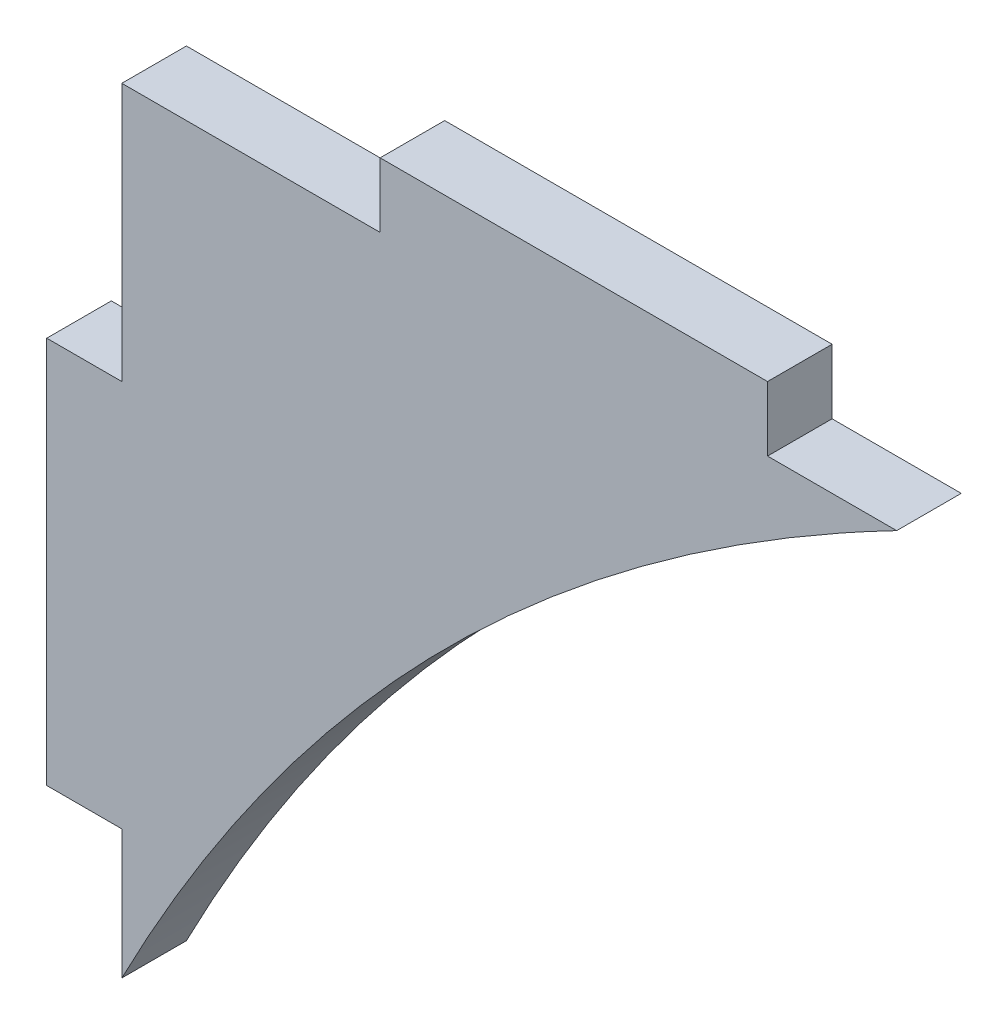
ISO-10303-21;
HEADER;
FILE_DESCRIPTION(('STEP AP214'),'2;1');
FILE_NAME('part.step','',(''),(''),'','','');
FILE_SCHEMA(('AUTOMOTIVE_DESIGN { 1 0 10303 214 1 1 1 1 }'));
ENDSEC;
DATA;
#1=APPLICATION_CONTEXT('core data for automotive mechanical design processes');
#2=APPLICATION_PROTOCOL_DEFINITION('international standard','automotive_design',2000,#1);
#3=PRODUCT_CONTEXT('',#1,'mechanical');
#4=PRODUCT('Part','Part','',(#3));
#5=PRODUCT_RELATED_PRODUCT_CATEGORY('part','',(#4));
#6=PRODUCT_DEFINITION_FORMATION('','',#4);
#7=PRODUCT_DEFINITION_CONTEXT('part definition',#1,'design');
#8=PRODUCT_DEFINITION('design','',#6,#7);
#9=PRODUCT_DEFINITION_SHAPE('','',#8);
#10=(LENGTH_UNIT() NAMED_UNIT(*) SI_UNIT(.MILLI.,.METRE.));
#11=(NAMED_UNIT(*) PLANE_ANGLE_UNIT() SI_UNIT($,.RADIAN.));
#12=(NAMED_UNIT(*) SI_UNIT($,.STERADIAN.) SOLID_ANGLE_UNIT());
#13=UNCERTAINTY_MEASURE_WITH_UNIT(LENGTH_MEASURE(1.E-05),#10,'distance_accuracy_value','');
#14=(GEOMETRIC_REPRESENTATION_CONTEXT(3) GLOBAL_UNCERTAINTY_ASSIGNED_CONTEXT((#13)) GLOBAL_UNIT_ASSIGNED_CONTEXT((#10,
#11,#12)) REPRESENTATION_CONTEXT('',''));
#15=CARTESIAN_POINT('',(0.,0.,0.));
#16=DIRECTION('',(0.,0.,1.));
#17=DIRECTION('',(1.,0.,0.));
#18=AXIS2_PLACEMENT_3D('',#15,#16,#17);
#19=CARTESIAN_POINT('',(-31.3311445366524,16.3895214720452,2.5));
#20=DIRECTION('',(1.,0.,0.));
#21=DIRECTION('',(0.,0.,-1.));
#22=AXIS2_PLACEMENT_3D('',#19,#20,#21);
#23=PLANE('',#22);
#24=DIRECTION('',(0.,-1.,0.));
#25=VECTOR('',#24,1.);
#26=CARTESIAN_POINT('',(-31.3311445366524,16.3895214720452,0.));
#27=LINE('',#26,#25);
#28=CARTESIAN_POINT('',(-31.3311445366524,16.3895214720452,0.));
#29=VERTEX_POINT('',#28);
#30=CARTESIAN_POINT('',(-31.3311445366524,6.38952147204518,0.));
#31=VERTEX_POINT('',#30);
#32=EDGE_CURVE('E150',#29,#31,#27,.T.);
#33=ORIENTED_EDGE('',*,*,#32,.T.);
#34=DIRECTION('',(0.,0.,-1.));
#35=VECTOR('',#34,1.);
#36=CARTESIAN_POINT('',(-31.3311445366524,6.38952147204518,2.5));
#37=LINE('',#36,#35);
#38=CARTESIAN_POINT('',(-31.3311445366524,6.38952147204518,2.5));
#39=VERTEX_POINT('',#38);
#40=EDGE_CURVE('E11',#39,#31,#37,.T.);
#41=ORIENTED_EDGE('',*,*,#40,.F.);
#42=DIRECTION('',(0.,-1.,0.));
#43=VECTOR('',#42,1.);
#44=CARTESIAN_POINT('',(-31.3311445366524,16.3895214720452,2.5));
#45=LINE('',#44,#43);
#46=CARTESIAN_POINT('',(-31.3311445366524,16.3895214720452,2.5));
#47=VERTEX_POINT('',#46);
#48=EDGE_CURVE('E182',#47,#39,#45,.T.);
#49=ORIENTED_EDGE('',*,*,#48,.F.);
#50=DIRECTION('',(0.,0.,-1.));
#51=VECTOR('',#50,1.);
#52=CARTESIAN_POINT('',(-31.3311445366524,16.3895214720452,2.5));
#53=LINE('',#52,#51);
#54=EDGE_CURVE('E49',#47,#29,#53,.T.);
#55=ORIENTED_EDGE('',*,*,#54,.T.);
#56=EDGE_LOOP('',(#33,#41,#49,#55));
#57=FACE_BOUND('',#56,.T.);
#58=ADVANCED_FACE('F33',(#57),#23,.F.);
#59=CARTESIAN_POINT('',(-31.3311445366524,6.38952147204518,2.5));
#60=DIRECTION('',(0.,-1.,0.));
#61=DIRECTION('',(0.,0.,-1.));
#62=AXIS2_PLACEMENT_3D('',#59,#60,#61);
#63=PLANE('',#62);
#64=DIRECTION('',(-1.,0.,0.));
#65=VECTOR('',#64,1.);
#66=CARTESIAN_POINT('',(-31.3311445366524,6.38952147204518,0.));
#67=LINE('',#66,#65);
#68=CARTESIAN_POINT('',(-34.238029984165,6.38952147204518,0.));
#69=VERTEX_POINT('',#68);
#70=EDGE_CURVE('E152',#31,#69,#67,.T.);
#71=ORIENTED_EDGE('',*,*,#70,.T.);
#72=DIRECTION('',(0.,0.,-1.));
#73=VECTOR('',#72,1.);
#74=CARTESIAN_POINT('',(-34.238029984165,6.38952147204518,2.5));
#75=LINE('',#74,#73);
#76=CARTESIAN_POINT('',(-34.238029984165,6.38952147204518,2.5));
#77=VERTEX_POINT('',#76);
#78=EDGE_CURVE('E41',#77,#69,#75,.T.);
#79=ORIENTED_EDGE('',*,*,#78,.F.);
#80=DIRECTION('',(-1.,0.,0.));
#81=VECTOR('',#80,1.);
#82=CARTESIAN_POINT('',(-31.3311445366524,6.38952147204518,2.5));
#83=LINE('',#82,#81);
#84=EDGE_CURVE('E97',#39,#77,#83,.T.);
#85=ORIENTED_EDGE('',*,*,#84,.F.);
#86=ORIENTED_EDGE('',*,*,#40,.T.);
#87=EDGE_LOOP('',(#71,#79,#85,#86));
#88=FACE_BOUND('',#87,.T.);
#89=ADVANCED_FACE('F242',(#88),#63,.F.);
#90=CARTESIAN_POINT('',(-34.238029984165,6.38952147204518,2.5));
#91=DIRECTION('',(1.,0.,0.));
#92=DIRECTION('',(0.,0.,-1.));
#93=AXIS2_PLACEMENT_3D('',#90,#91,#92);
#94=PLANE('',#93);
#95=DIRECTION('',(0.,-1.,0.));
#96=VECTOR('',#95,1.);
#97=CARTESIAN_POINT('',(-34.238029984165,6.38952147204518,0.));
#98=LINE('',#97,#96);
#99=CARTESIAN_POINT('',(-34.238029984165,-8.61047852795482,0.));
#100=VERTEX_POINT('',#99);
#101=EDGE_CURVE('E154',#69,#100,#98,.T.);
#102=ORIENTED_EDGE('',*,*,#101,.T.);
#103=DIRECTION('',(0.,0.,-1.));
#104=VECTOR('',#103,1.);
#105=CARTESIAN_POINT('',(-34.238029984165,-8.61047852795482,2.5));
#106=LINE('',#105,#104);
#107=CARTESIAN_POINT('',(-34.238029984165,-8.61047852795482,2.5));
#108=VERTEX_POINT('',#107);
#109=EDGE_CURVE('E195',#108,#100,#106,.T.);
#110=ORIENTED_EDGE('',*,*,#109,.F.);
#111=DIRECTION('',(0.,-1.,0.));
#112=VECTOR('',#111,1.);
#113=CARTESIAN_POINT('',(-34.238029984165,6.38952147204518,2.5));
#114=LINE('',#113,#112);
#115=EDGE_CURVE('E202',#77,#108,#114,.T.);
#116=ORIENTED_EDGE('',*,*,#115,.F.);
#117=ORIENTED_EDGE('',*,*,#78,.T.);
#118=EDGE_LOOP('',(#102,#110,#116,#117));
#119=FACE_BOUND('',#118,.T.);
#120=ADVANCED_FACE('F200',(#119),#94,.F.);
#121=CARTESIAN_POINT('',(-31.3311445366524,-8.61047852795482,2.5));
#122=DIRECTION('',(0.,-1.,0.));
#123=DIRECTION('',(0.,0.,-1.));
#124=AXIS2_PLACEMENT_3D('',#121,#122,#123);
#125=PLANE('',#124);
#126=DIRECTION('',(-1.,0.,0.));
#127=VECTOR('',#126,1.);
#128=CARTESIAN_POINT('',(-31.3311445366524,-8.61047852795482,0.));
#129=LINE('',#128,#127);
#130=CARTESIAN_POINT('',(-31.3311445366524,-8.61047852795482,0.));
#131=VERTEX_POINT('',#130);
#132=EDGE_CURVE('E157',#131,#100,#129,.T.);
#133=ORIENTED_EDGE('',*,*,#132,.F.);
#134=DIRECTION('',(0.,0.,-1.));
#135=VECTOR('',#134,1.);
#136=CARTESIAN_POINT('',(-31.3311445366524,-8.61047852795482,2.5));
#137=LINE('',#136,#135);
#138=CARTESIAN_POINT('',(-31.3311445366524,-8.61047852795482,2.5));
#139=VERTEX_POINT('',#138);
#140=EDGE_CURVE('E193',#139,#131,#137,.T.);
#141=ORIENTED_EDGE('',*,*,#140,.F.);
#142=DIRECTION('',(-1.,0.,0.));
#143=VECTOR('',#142,1.);
#144=CARTESIAN_POINT('',(-31.3311445366524,-8.61047852795482,2.5));
#145=LINE('',#144,#143);
#146=EDGE_CURVE('E213',#139,#108,#145,.T.);
#147=ORIENTED_EDGE('',*,*,#146,.T.);
#148=ORIENTED_EDGE('',*,*,#109,.T.);
#149=EDGE_LOOP('',(#133,#141,#147,#148));
#150=FACE_BOUND('',#149,.T.);
#151=ADVANCED_FACE('F209',(#150),#125,.T.);
#152=CARTESIAN_POINT('',(-31.3311445366524,-8.61047852795482,2.5));
#153=DIRECTION('',(1.,0.,0.));
#154=DIRECTION('',(0.,1.,0.));
#155=AXIS2_PLACEMENT_3D('',#152,#153,#154);
#156=PLANE('',#155);
#157=DIRECTION('',(0.,-1.,0.));
#158=VECTOR('',#157,1.);
#159=CARTESIAN_POINT('',(-31.3311445366524,-8.61047852795482,0.));
#160=LINE('',#159,#158);
#161=CARTESIAN_POINT('',(-31.3311445366524,-13.6104785279548,0.));
#162=VERTEX_POINT('',#161);
#163=EDGE_CURVE('E160',#131,#162,#160,.T.);
#164=ORIENTED_EDGE('',*,*,#163,.T.);
#165=DIRECTION('',(0.,0.,-1.));
#166=VECTOR('',#165,1.);
#167=CARTESIAN_POINT('',(-31.3311445366524,-13.6104785279548,2.5));
#168=LINE('',#167,#166);
#169=CARTESIAN_POINT('',(-31.3311445366524,-13.6104785279548,2.5));
#170=VERTEX_POINT('',#169);
#171=EDGE_CURVE('E190',#170,#162,#168,.T.);
#172=ORIENTED_EDGE('',*,*,#171,.F.);
#173=DIRECTION('',(0.,-1.,0.));
#174=VECTOR('',#173,1.);
#175=CARTESIAN_POINT('',(-31.3311445366524,-8.61047852795482,2.5));
#176=LINE('',#175,#174);
#177=EDGE_CURVE('E214',#139,#170,#176,.T.);
#178=ORIENTED_EDGE('',*,*,#177,.F.);
#179=ORIENTED_EDGE('',*,*,#140,.T.);
#180=EDGE_LOOP('',(#164,#172,#178,#179));
#181=FACE_BOUND('',#180,.T.);
#182=ADVANCED_FACE('F233',(#181),#156,.F.);
#183=CARTESIAN_POINT('',(-31.3311445366524,-13.6104785279548,2.5));
#184=CARTESIAN_POINT('',(-21.0828458594025,6.1912700099249,2.5));
#185=CARTESIAN_POINT('',(-1.33114453665238,16.3895214720452,2.5));
#186=B_SPLINE_CURVE_WITH_KNOTS('',2,(#183,#184,#185),.UNSPECIFIED.,.F.,.F.,(3,3),(0.,1.),.UNSPECIFIED.);
#187=DIRECTION('',(0.,0.,-1.));
#188=VECTOR('',#187,1.);
#189=SURFACE_OF_LINEAR_EXTRUSION('',#186,#188);
#190=CARTESIAN_POINT('',(-31.3311445366524,-13.6104785279548,0.));
#191=CARTESIAN_POINT('',(-21.0828458594025,6.1912700099249,0.));
#192=CARTESIAN_POINT('',(-1.33114453665238,16.3895214720452,0.));
#193=B_SPLINE_CURVE_WITH_KNOTS('',2,(#190,#191,#192),.UNSPECIFIED.,.F.,.F.,(3,3),(0.,1.),.UNSPECIFIED.);
#194=CARTESIAN_POINT('',(-1.33114453665238,16.3895214720452,0.));
#195=VERTEX_POINT('',#194);
#196=EDGE_CURVE('E162',#162,#195,#193,.T.);
#197=ORIENTED_EDGE('',*,*,#196,.T.);
#198=DIRECTION('',(0.,0.,-1.));
#199=VECTOR('',#198,1.);
#200=CARTESIAN_POINT('',(-1.33114453665238,16.3895214720452,2.5));
#201=LINE('',#200,#199);
#202=CARTESIAN_POINT('',(-1.33114453665238,16.3895214720452,2.5));
#203=VERTEX_POINT('',#202);
#204=EDGE_CURVE('E188',#203,#195,#201,.T.);
#205=ORIENTED_EDGE('',*,*,#204,.F.);
#206=EDGE_CURVE('E216',#170,#203,#186,.T.);
#207=ORIENTED_EDGE('',*,*,#206,.F.);
#208=ORIENTED_EDGE('',*,*,#171,.T.);
#209=EDGE_LOOP('',(#197,#205,#207,#208));
#210=FACE_BOUND('',#209,.T.);
#211=ADVANCED_FACE('F228',(#210),#189,.F.);
#212=CARTESIAN_POINT('',(-6.33114453665238,16.3895214720452,2.5));
#213=DIRECTION('',(0.,1.,0.));
#214=DIRECTION('',(0.,0.,1.));
#215=AXIS2_PLACEMENT_3D('',#212,#213,#214);
#216=PLANE('',#215);
#217=DIRECTION('',(1.,0.,0.));
#218=VECTOR('',#217,1.);
#219=CARTESIAN_POINT('',(-6.33114453665238,16.3895214720452,0.));
#220=LINE('',#219,#218);
#221=CARTESIAN_POINT('',(-6.33114453665238,16.3895214720452,0.));
#222=VERTEX_POINT('',#221);
#223=EDGE_CURVE('E167',#222,#195,#220,.T.);
#224=ORIENTED_EDGE('',*,*,#223,.F.);
#225=DIRECTION('',(0.,0.,-1.));
#226=VECTOR('',#225,1.);
#227=CARTESIAN_POINT('',(-6.33114453665238,16.3895214720452,2.5));
#228=LINE('',#227,#226);
#229=CARTESIAN_POINT('',(-6.33114453665238,16.3895214720452,2.5));
#230=VERTEX_POINT('',#229);
#231=EDGE_CURVE('E186',#230,#222,#228,.T.);
#232=ORIENTED_EDGE('',*,*,#231,.F.);
#233=DIRECTION('',(1.,0.,0.));
#234=VECTOR('',#233,1.);
#235=CARTESIAN_POINT('',(-6.33114453665238,16.3895214720452,2.5));
#236=LINE('',#235,#234);
#237=EDGE_CURVE('E145',#230,#203,#236,.T.);
#238=ORIENTED_EDGE('',*,*,#237,.T.);
#239=ORIENTED_EDGE('',*,*,#204,.T.);
#240=EDGE_LOOP('',(#224,#232,#238,#239));
#241=FACE_BOUND('',#240,.T.);
#242=ADVANCED_FACE('F232',(#241),#216,.T.);
#243=CARTESIAN_POINT('',(-6.33114453665238,18.8895214720452,2.5));
#244=DIRECTION('',(1.,0.,0.));
#245=DIRECTION('',(0.,1.,0.));
#246=AXIS2_PLACEMENT_3D('',#243,#244,#245);
#247=PLANE('',#246);
#248=DIRECTION('',(0.,-1.,0.));
#249=VECTOR('',#248,1.);
#250=CARTESIAN_POINT('',(-6.33114453665238,18.8895214720452,0.));
#251=LINE('',#250,#249);
#252=CARTESIAN_POINT('',(-6.33114453665238,18.8895214720452,0.));
#253=VERTEX_POINT('',#252);
#254=EDGE_CURVE('E173',#253,#222,#251,.T.);
#255=ORIENTED_EDGE('',*,*,#254,.F.);
#256=DIRECTION('',(0.,0.,-1.));
#257=VECTOR('',#256,1.);
#258=CARTESIAN_POINT('',(-6.33114453665238,18.8895214720452,2.5));
#259=LINE('',#258,#257);
#260=CARTESIAN_POINT('',(-6.33114453665238,18.8895214720452,2.5));
#261=VERTEX_POINT('',#260);
#262=EDGE_CURVE('E131',#261,#253,#259,.T.);
#263=ORIENTED_EDGE('',*,*,#262,.F.);
#264=DIRECTION('',(0.,-1.,0.));
#265=VECTOR('',#264,1.);
#266=CARTESIAN_POINT('',(-6.33114453665238,18.8895214720452,2.5));
#267=LINE('',#266,#265);
#268=EDGE_CURVE('E143',#261,#230,#267,.T.);
#269=ORIENTED_EDGE('',*,*,#268,.T.);
#270=ORIENTED_EDGE('',*,*,#231,.T.);
#271=EDGE_LOOP('',(#255,#263,#269,#270));
#272=FACE_BOUND('',#271,.T.);
#273=ADVANCED_FACE('F260',(#272),#247,.T.);
#274=CARTESIAN_POINT('',(-21.3311445366524,18.8895214720452,2.5));
#275=DIRECTION('',(0.,1.,0.));
#276=DIRECTION('',(-1.,0.,0.));
#277=AXIS2_PLACEMENT_3D('',#274,#275,#276);
#278=PLANE('',#277);
#279=DIRECTION('',(1.,0.,0.));
#280=VECTOR('',#279,1.);
#281=CARTESIAN_POINT('',(-21.3311445366524,18.8895214720452,0.));
#282=LINE('',#281,#280);
#283=CARTESIAN_POINT('',(-21.3311445366524,18.8895214720452,0.));
#284=VERTEX_POINT('',#283);
#285=EDGE_CURVE('E128',#284,#253,#282,.T.);
#286=ORIENTED_EDGE('',*,*,#285,.F.);
#287=DIRECTION('',(0.,0.,-1.));
#288=VECTOR('',#287,1.);
#289=CARTESIAN_POINT('',(-21.3311445366524,18.8895214720452,2.5));
#290=LINE('',#289,#288);
#291=CARTESIAN_POINT('',(-21.3311445366524,18.8895214720452,2.5));
#292=VERTEX_POINT('',#291);
#293=EDGE_CURVE('E122',#292,#284,#290,.T.);
#294=ORIENTED_EDGE('',*,*,#293,.F.);
#295=DIRECTION('',(1.,0.,0.));
#296=VECTOR('',#295,1.);
#297=CARTESIAN_POINT('',(-21.3311445366524,18.8895214720452,2.5));
#298=LINE('',#297,#296);
#299=EDGE_CURVE('E126',#292,#261,#298,.T.);
#300=ORIENTED_EDGE('',*,*,#299,.T.);
#301=ORIENTED_EDGE('',*,*,#262,.T.);
#302=EDGE_LOOP('',(#286,#294,#300,#301));
#303=FACE_BOUND('',#302,.T.);
#304=ADVANCED_FACE('F124',(#303),#278,.T.);
#305=CARTESIAN_POINT('',(-21.3311445366524,18.8895214720452,2.5));
#306=DIRECTION('',(1.,0.,0.));
#307=DIRECTION('',(0.,0.,-1.));
#308=AXIS2_PLACEMENT_3D('',#305,#306,#307);
#309=PLANE('',#308);
#310=DIRECTION('',(0.,-1.,0.));
#311=VECTOR('',#310,1.);
#312=CARTESIAN_POINT('',(-21.3311445366524,18.8895214720452,0.));
#313=LINE('',#312,#311);
#314=CARTESIAN_POINT('',(-21.3311445366524,16.3895214720452,0.));
#315=VERTEX_POINT('',#314);
#316=EDGE_CURVE('E177',#284,#315,#313,.T.);
#317=ORIENTED_EDGE('',*,*,#316,.T.);
#318=DIRECTION('',(0.,0.,-1.));
#319=VECTOR('',#318,1.);
#320=CARTESIAN_POINT('',(-21.3311445366524,16.3895214720452,2.5));
#321=LINE('',#320,#319);
#322=CARTESIAN_POINT('',(-21.3311445366524,16.3895214720452,2.5));
#323=VERTEX_POINT('',#322);
#324=EDGE_CURVE('E85',#323,#315,#321,.T.);
#325=ORIENTED_EDGE('',*,*,#324,.F.);
#326=DIRECTION('',(0.,-1.,0.));
#327=VECTOR('',#326,1.);
#328=CARTESIAN_POINT('',(-21.3311445366524,18.8895214720452,2.5));
#329=LINE('',#328,#327);
#330=EDGE_CURVE('E133',#292,#323,#329,.T.);
#331=ORIENTED_EDGE('',*,*,#330,.F.);
#332=ORIENTED_EDGE('',*,*,#293,.T.);
#333=EDGE_LOOP('',(#317,#325,#331,#332));
#334=FACE_BOUND('',#333,.T.);
#335=ADVANCED_FACE('F134',(#334),#309,.F.);
#336=CARTESIAN_POINT('',(-31.3311445366524,16.3895214720452,2.5));
#337=DIRECTION('',(0.,1.,0.));
#338=DIRECTION('',(-1.,0.,0.));
#339=AXIS2_PLACEMENT_3D('',#336,#337,#338);
#340=PLANE('',#339);
#341=DIRECTION('',(1.,0.,0.));
#342=VECTOR('',#341,1.);
#343=CARTESIAN_POINT('',(-31.3311445366524,16.3895214720452,0.));
#344=LINE('',#343,#342);
#345=EDGE_CURVE('E179',#29,#315,#344,.T.);
#346=ORIENTED_EDGE('',*,*,#345,.F.);
#347=ORIENTED_EDGE('',*,*,#54,.F.);
#348=DIRECTION('',(1.,0.,0.));
#349=VECTOR('',#348,1.);
#350=CARTESIAN_POINT('',(-31.3311445366524,16.3895214720452,2.5));
#351=LINE('',#350,#349);
#352=EDGE_CURVE('E137',#47,#323,#351,.T.);
#353=ORIENTED_EDGE('',*,*,#352,.T.);
#354=ORIENTED_EDGE('',*,*,#324,.T.);
#355=EDGE_LOOP('',(#346,#347,#353,#354));
#356=FACE_BOUND('',#355,.T.);
#357=ADVANCED_FACE('F248',(#356),#340,.T.);
#358=CARTESIAN_POINT('',(-18.7069951980274,3.79039574098504,2.5));
#359=DIRECTION('',(0.,0.,1.));
#360=DIRECTION('',(1.,0.,0.));
#361=AXIS2_PLACEMENT_3D('',#358,#359,#360);
#362=PLANE('',#361);
#363=ORIENTED_EDGE('',*,*,#48,.T.);
#364=ORIENTED_EDGE('',*,*,#84,.T.);
#365=ORIENTED_EDGE('',*,*,#115,.T.);
#366=ORIENTED_EDGE('',*,*,#146,.F.);
#367=ORIENTED_EDGE('',*,*,#177,.T.);
#368=ORIENTED_EDGE('',*,*,#206,.T.);
#369=ORIENTED_EDGE('',*,*,#237,.F.);
#370=ORIENTED_EDGE('',*,*,#268,.F.);
#371=ORIENTED_EDGE('',*,*,#299,.F.);
#372=ORIENTED_EDGE('',*,*,#330,.T.);
#373=ORIENTED_EDGE('',*,*,#352,.F.);
#374=EDGE_LOOP('',(#363,#364,#365,#366,#367,#368,#369,#370,#371,#372,#373));
#375=FACE_BOUND('',#374,.T.);
#376=ADVANCED_FACE('F140',(#375),#362,.T.);
#377=CARTESIAN_POINT('',(-18.7069951980274,3.79039574098504,0.));
#378=DIRECTION('',(0.,0.,1.));
#379=DIRECTION('',(1.,0.,0.));
#380=AXIS2_PLACEMENT_3D('',#377,#378,#379);
#381=PLANE('',#380);
#382=ORIENTED_EDGE('',*,*,#32,.F.);
#383=ORIENTED_EDGE('',*,*,#345,.T.);
#384=ORIENTED_EDGE('',*,*,#316,.F.);
#385=ORIENTED_EDGE('',*,*,#285,.T.);
#386=ORIENTED_EDGE('',*,*,#254,.T.);
#387=ORIENTED_EDGE('',*,*,#223,.T.);
#388=ORIENTED_EDGE('',*,*,#196,.F.);
#389=ORIENTED_EDGE('',*,*,#163,.F.);
#390=ORIENTED_EDGE('',*,*,#132,.T.);
#391=ORIENTED_EDGE('',*,*,#101,.F.);
#392=ORIENTED_EDGE('',*,*,#70,.F.);
#393=EDGE_LOOP('',(#382,#383,#384,#385,#386,#387,#388,#389,#390,#391,#392));
#394=FACE_BOUND('',#393,.T.);
#395=ADVANCED_FACE('F204',(#394),#381,.F.);
#396=CLOSED_SHELL('',(#58,#89,#120,#151,#182,#211,#242,#273,#304,#335,#357,#376,#395));
#397=MANIFOLD_SOLID_BREP('B2',#396);
#398=ADVANCED_BREP_SHAPE_REPRESENTATION('',(#18,#397),#14);
#399=SHAPE_DEFINITION_REPRESENTATION(#9,#398);
ENDSEC;
END-ISO-10303-21;
